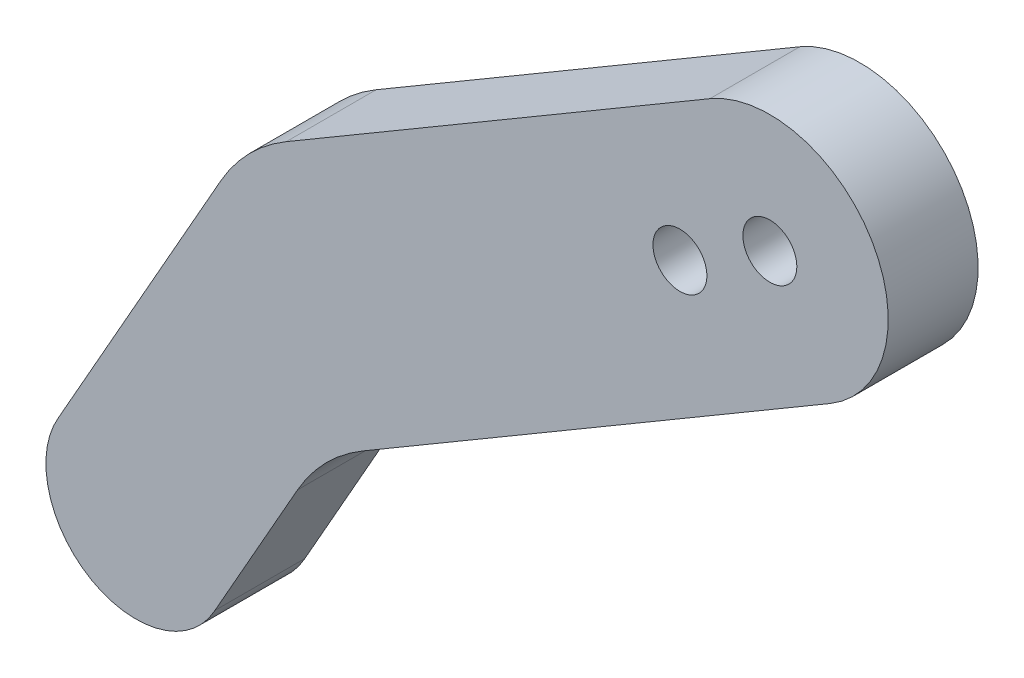
ISO-10303-21;
HEADER;
FILE_DESCRIPTION(('STEP AP214'),'2;1');
FILE_NAME('part.step','',(''),(''),'','','');
FILE_SCHEMA(('AUTOMOTIVE_DESIGN { 1 0 10303 214 1 1 1 1 }'));
ENDSEC;
DATA;
#1=APPLICATION_CONTEXT('core data for automotive mechanical design processes');
#2=APPLICATION_PROTOCOL_DEFINITION('international standard','automotive_design',2000,#1);
#3=PRODUCT_CONTEXT('',#1,'mechanical');
#4=PRODUCT('Part','Part','',(#3));
#5=PRODUCT_RELATED_PRODUCT_CATEGORY('part','',(#4));
#6=PRODUCT_DEFINITION_FORMATION('','',#4);
#7=PRODUCT_DEFINITION_CONTEXT('part definition',#1,'design');
#8=PRODUCT_DEFINITION('design','',#6,#7);
#9=PRODUCT_DEFINITION_SHAPE('','',#8);
#10=(LENGTH_UNIT() NAMED_UNIT(*) SI_UNIT(.MILLI.,.METRE.));
#11=(NAMED_UNIT(*) PLANE_ANGLE_UNIT() SI_UNIT($,.RADIAN.));
#12=(NAMED_UNIT(*) SI_UNIT($,.STERADIAN.) SOLID_ANGLE_UNIT());
#13=UNCERTAINTY_MEASURE_WITH_UNIT(LENGTH_MEASURE(1.E-05),#10,'distance_accuracy_value','');
#14=(GEOMETRIC_REPRESENTATION_CONTEXT(3) GLOBAL_UNCERTAINTY_ASSIGNED_CONTEXT((#13)) GLOBAL_UNIT_ASSIGNED_CONTEXT((#10,
#11,#12)) REPRESENTATION_CONTEXT('',''));
#15=CARTESIAN_POINT('',(0.,0.,0.));
#16=DIRECTION('',(0.,0.,1.));
#17=DIRECTION('',(1.,0.,0.));
#18=AXIS2_PLACEMENT_3D('',#15,#16,#17);
#19=CARTESIAN_POINT('',(8.69918007203384,-4.93196371380907,5.));
#20=DIRECTION('',(-0.869918007203384,0.493196371380907,0.));
#21=DIRECTION('',(-0.493196371380907,-0.869918007203384,0.));
#22=AXIS2_PLACEMENT_3D('',#19,#20,#21);
#23=PLANE('',#22);
#24=DIRECTION('',(0.493196371380907,0.869918007203384,0.));
#25=VECTOR('',#24,1.);
#26=CARTESIAN_POINT('',(8.69918007203384,-4.93196371380907,0.));
#27=LINE('',#26,#25);
#28=CARTESIAN_POINT('',(8.69918007203384,-4.93196371380907,0.));
#29=VERTEX_POINT('',#28);
#30=CARTESIAN_POINT('',(13.29602083439,3.17611409751714,0.));
#31=VERTEX_POINT('',#30);
#32=EDGE_CURVE('E132',#29,#31,#27,.T.);
#33=ORIENTED_EDGE('',*,*,#32,.T.);
#34=DIRECTION('',(0.,0.,-1.));
#35=VECTOR('',#34,1.);
#36=CARTESIAN_POINT('',(13.29602083439,3.17611409751714,5.));
#37=LINE('',#36,#35);
#38=CARTESIAN_POINT('',(13.29602083439,3.17611409751714,5.));
#39=VERTEX_POINT('',#38);
#40=EDGE_CURVE('E11',#39,#31,#37,.T.);
#41=ORIENTED_EDGE('',*,*,#40,.F.);
#42=DIRECTION('',(0.493196371380907,0.869918007203384,0.));
#43=VECTOR('',#42,1.);
#44=CARTESIAN_POINT('',(8.69918007203384,-4.93196371380907,5.));
#45=LINE('',#44,#43);
#46=CARTESIAN_POINT('',(8.69918007203384,-4.93196371380907,5.));
#47=VERTEX_POINT('',#46);
#48=EDGE_CURVE('E151',#47,#39,#45,.T.);
#49=ORIENTED_EDGE('',*,*,#48,.F.);
#50=DIRECTION('',(0.,0.,-1.));
#51=VECTOR('',#50,1.);
#52=CARTESIAN_POINT('',(8.69918007203384,-4.93196371380907,5.));
#53=LINE('',#52,#51);
#54=EDGE_CURVE('E128',#47,#29,#53,.T.);
#55=ORIENTED_EDGE('',*,*,#54,.T.);
#56=EDGE_LOOP('',(#33,#41,#49,#55));
#57=FACE_BOUND('',#56,.T.);
#58=ADVANCED_FACE('F35',(#57),#23,.F.);
#59=CARTESIAN_POINT('',(21.9952009064238,-1.75584961629193,5.));
#60=DIRECTION('',(0.,0.,-1.));
#61=DIRECTION('',(-1.,0.,0.));
#62=AXIS2_PLACEMENT_3D('',#59,#60,#61);
#63=CYLINDRICAL_SURFACE('',#62,10.);
#64=CARTESIAN_POINT('',(21.9952009064238,-1.75584961629193,0.));
#65=DIRECTION('',(0.,0.,1.));
#66=DIRECTION('',(1.,0.,0.));
#67=AXIS2_PLACEMENT_3D('',#64,#65,#66);
#68=CIRCLE('',#67,10.);
#69=CARTESIAN_POINT('',(16.9274718288517,6.86494628642669,0.));
#70=VERTEX_POINT('',#69);
#71=EDGE_CURVE('E135',#31,#70,#68,.F.);
#72=ORIENTED_EDGE('',*,*,#71,.T.);
#73=DIRECTION('',(0.,0.,-1.));
#74=VECTOR('',#73,1.);
#75=CARTESIAN_POINT('',(16.9274718288517,6.86494628642669,5.));
#76=LINE('',#75,#74);
#77=CARTESIAN_POINT('',(16.9274718288517,6.86494628642669,5.));
#78=VERTEX_POINT('',#77);
#79=EDGE_CURVE('E44',#78,#70,#76,.T.);
#80=ORIENTED_EDGE('',*,*,#79,.F.);
#81=CARTESIAN_POINT('',(21.9952009064238,-1.75584961629193,5.));
#82=DIRECTION('',(0.,0.,1.));
#83=DIRECTION('',(1.,0.,0.));
#84=AXIS2_PLACEMENT_3D('',#81,#82,#83);
#85=CIRCLE('',#84,10.);
#86=EDGE_CURVE('E92',#39,#78,#85,.F.);
#87=ORIENTED_EDGE('',*,*,#86,.F.);
#88=ORIENTED_EDGE('',*,*,#40,.T.);
#89=EDGE_LOOP('',(#72,#80,#87,#88));
#90=FACE_BOUND('',#89,.T.);
#91=ADVANCED_FACE('F201',(#90),#63,.F.);
#92=CARTESIAN_POINT('',(1.34814467413126,-2.29335071096395,5.));
#93=DIRECTION('',(-0.50677290775721,0.862079590271862,0.));
#94=DIRECTION('',(-0.862079590271862,-0.50677290775721,0.));
#95=AXIS2_PLACEMENT_3D('',#92,#93,#94);
#96=PLANE('',#95);
#97=DIRECTION('',(0.862079590271862,0.50677290775721,0.));
#98=VECTOR('',#97,1.);
#99=CARTESIAN_POINT('',(1.34814467413126,-2.29335071096395,0.));
#100=LINE('',#99,#98);
#101=CARTESIAN_POINT('',(42.8887717127369,22.1262789751689,0.));
#102=VERTEX_POINT('',#101);
#103=EDGE_CURVE('E138',#70,#102,#100,.T.);
#104=ORIENTED_EDGE('',*,*,#103,.T.);
#105=DIRECTION('',(0.,0.,-1.));
#106=VECTOR('',#105,1.);
#107=CARTESIAN_POINT('',(42.8887717127369,22.1262789751689,5.));
#108=LINE('',#107,#106);
#109=CARTESIAN_POINT('',(42.8887717127369,22.1262789751689,5.));
#110=VERTEX_POINT('',#109);
#111=EDGE_CURVE('E157',#110,#102,#108,.T.);
#112=ORIENTED_EDGE('',*,*,#111,.F.);
#113=DIRECTION('',(0.862079590271862,0.50677290775721,0.));
#114=VECTOR('',#113,1.);
#115=CARTESIAN_POINT('',(1.34814467413126,-2.29335071096395,5.));
#116=LINE('',#115,#114);
#117=EDGE_CURVE('E174',#78,#110,#116,.T.);
#118=ORIENTED_EDGE('',*,*,#117,.F.);
#119=ORIENTED_EDGE('',*,*,#79,.T.);
#120=EDGE_LOOP('',(#104,#112,#118,#119));
#121=FACE_BOUND('',#120,.T.);
#122=ADVANCED_FACE('F205',(#121),#96,.F.);
#123=CARTESIAN_POINT('',(39.5541416099459,27.7988721795781,5.));
#124=DIRECTION('',(0.,0.,-1.));
#125=DIRECTION('',(-1.,0.,0.));
#126=AXIS2_PLACEMENT_3D('',#123,#124,#125);
#127=CYLINDRICAL_SURFACE('',#126,6.58012701892219);
#128=CARTESIAN_POINT('',(39.5541416099459,27.7988721795781,0.));
#129=DIRECTION('',(0.,0.,1.));
#130=DIRECTION('',(1.,0.,0.));
#131=AXIS2_PLACEMENT_3D('',#128,#129,#130);
#132=CIRCLE('',#131,6.58012701892219);
#133=CARTESIAN_POINT('',(36.2195115071549,33.4714653839874,0.));
#134=VERTEX_POINT('',#133);
#135=EDGE_CURVE('E141',#134,#102,#132,.F.);
#136=ORIENTED_EDGE('',*,*,#135,.F.);
#137=DIRECTION('',(0.,0.,-1.));
#138=VECTOR('',#137,1.);
#139=CARTESIAN_POINT('',(36.2195115071549,33.4714653839874,5.));
#140=LINE('',#139,#138);
#141=CARTESIAN_POINT('',(36.2195115071549,33.4714653839874,5.));
#142=VERTEX_POINT('',#141);
#143=EDGE_CURVE('E155',#142,#134,#140,.T.);
#144=ORIENTED_EDGE('',*,*,#143,.F.);
#145=CARTESIAN_POINT('',(39.5541416099459,27.7988721795781,5.));
#146=DIRECTION('',(0.,0.,1.));
#147=DIRECTION('',(1.,0.,0.));
#148=AXIS2_PLACEMENT_3D('',#145,#146,#147);
#149=CIRCLE('',#148,6.58012701892219);
#150=EDGE_CURVE('E176',#142,#110,#149,.F.);
#151=ORIENTED_EDGE('',*,*,#150,.T.);
#152=ORIENTED_EDGE('',*,*,#111,.T.);
#153=EDGE_LOOP('',(#136,#144,#151,#152));
#154=FACE_BOUND('',#153,.T.);
#155=ADVANCED_FACE('F209',(#154),#127,.T.);
#156=CARTESIAN_POINT('',(-5.32111553145072,9.05183569785457,5.));
#157=DIRECTION('',(-0.50677290775721,0.862079590271863,0.));
#158=DIRECTION('',(-0.862079590271862,-0.50677290775721,0.));
#159=AXIS2_PLACEMENT_3D('',#156,#157,#158);
#160=PLANE('',#159);
#161=DIRECTION('',(0.862079590271863,0.50677290775721,0.));
#162=VECTOR('',#161,1.);
#163=CARTESIAN_POINT('',(-5.32111553145072,9.05183569785457,0.));
#164=LINE('',#163,#162);
#165=CARTESIAN_POINT('',(12.6670590992461,19.6261720650662,0.));
#166=VERTEX_POINT('',#165);
#167=EDGE_CURVE('E144',#166,#134,#164,.T.);
#168=ORIENTED_EDGE('',*,*,#167,.F.);
#169=DIRECTION('',(0.,0.,-1.));
#170=VECTOR('',#169,1.);
#171=CARTESIAN_POINT('',(12.6670590992461,19.6261720650662,5.));
#172=LINE('',#171,#170);
#173=CARTESIAN_POINT('',(12.6670590992461,19.6261720650662,5.));
#174=VERTEX_POINT('',#173);
#175=EDGE_CURVE('E117',#174,#166,#172,.T.);
#176=ORIENTED_EDGE('',*,*,#175,.F.);
#177=DIRECTION('',(0.862079590271863,0.50677290775721,0.));
#178=VECTOR('',#177,1.);
#179=CARTESIAN_POINT('',(-5.32111553145072,9.05183569785457,5.));
#180=LINE('',#179,#178);
#181=EDGE_CURVE('E124',#174,#142,#180,.T.);
#182=ORIENTED_EDGE('',*,*,#181,.T.);
#183=ORIENTED_EDGE('',*,*,#143,.T.);
#184=EDGE_LOOP('',(#168,#176,#182,#183));
#185=FACE_BOUND('',#184,.T.);
#186=ADVANCED_FACE('F180',(#185),#160,.T.);
#187=CARTESIAN_POINT('',(17.7347881768181,11.0053761623476,5.));
#188=DIRECTION('',(0.,0.,-1.));
#189=DIRECTION('',(-1.,0.,0.));
#190=AXIS2_PLACEMENT_3D('',#187,#188,#189);
#191=CYLINDRICAL_SURFACE('',#190,10.);
#192=CARTESIAN_POINT('',(17.7347881768181,11.0053761623476,0.));
#193=DIRECTION('',(0.,0.,1.));
#194=DIRECTION('',(1.,0.,0.));
#195=AXIS2_PLACEMENT_3D('',#192,#193,#194);
#196=CIRCLE('',#195,10.);
#197=CARTESIAN_POINT('',(9.03560810478431,15.9373398761567,0.));
#198=VERTEX_POINT('',#197);
#199=EDGE_CURVE('E112',#198,#166,#196,.F.);
#200=ORIENTED_EDGE('',*,*,#199,.F.);
#201=DIRECTION('',(0.,0.,-1.));
#202=VECTOR('',#201,1.);
#203=CARTESIAN_POINT('',(9.03560810478431,15.9373398761567,5.));
#204=LINE('',#203,#202);
#205=CARTESIAN_POINT('',(9.03560810478431,15.9373398761567,5.));
#206=VERTEX_POINT('',#205);
#207=EDGE_CURVE('E107',#206,#198,#204,.T.);
#208=ORIENTED_EDGE('',*,*,#207,.F.);
#209=CARTESIAN_POINT('',(17.7347881768181,11.0053761623476,5.));
#210=DIRECTION('',(0.,0.,1.));
#211=DIRECTION('',(1.,0.,0.));
#212=AXIS2_PLACEMENT_3D('',#209,#210,#211);
#213=CIRCLE('',#212,10.);
#214=EDGE_CURVE('E110',#206,#174,#213,.F.);
#215=ORIENTED_EDGE('',*,*,#214,.T.);
#216=ORIENTED_EDGE('',*,*,#175,.T.);
#217=EDGE_LOOP('',(#200,#208,#215,#216));
#218=FACE_BOUND('',#217,.T.);
#219=ADVANCED_FACE('F109',(#218),#191,.T.);
#220=CARTESIAN_POINT('',(0.,0.,5.));
#221=DIRECTION('',(-0.869918007203384,0.493196371380907,0.));
#222=DIRECTION('',(-0.493196371380907,-0.869918007203384,0.));
#223=AXIS2_PLACEMENT_3D('',#220,#221,#222);
#224=PLANE('',#223);
#225=DIRECTION('',(0.493196371380907,0.869918007203384,0.));
#226=VECTOR('',#225,1.);
#227=CARTESIAN_POINT('',(0.,0.,0.));
#228=LINE('',#227,#226);
#229=CARTESIAN_POINT('',(0.,0.,0.));
#230=VERTEX_POINT('',#229);
#231=EDGE_CURVE('E148',#230,#198,#228,.T.);
#232=ORIENTED_EDGE('',*,*,#231,.F.);
#233=DIRECTION('',(0.,0.,-1.));
#234=VECTOR('',#233,1.);
#235=CARTESIAN_POINT('',(0.,0.,5.));
#236=LINE('',#235,#234);
#237=CARTESIAN_POINT('',(0.,0.,5.));
#238=VERTEX_POINT('',#237);
#239=EDGE_CURVE('E81',#238,#230,#236,.T.);
#240=ORIENTED_EDGE('',*,*,#239,.F.);
#241=DIRECTION('',(0.493196371380907,0.869918007203384,0.));
#242=VECTOR('',#241,1.);
#243=CARTESIAN_POINT('',(0.,0.,5.));
#244=LINE('',#243,#242);
#245=EDGE_CURVE('E121',#238,#206,#244,.T.);
#246=ORIENTED_EDGE('',*,*,#245,.T.);
#247=ORIENTED_EDGE('',*,*,#207,.T.);
#248=EDGE_LOOP('',(#232,#240,#246,#247));
#249=FACE_BOUND('',#248,.T.);
#250=ADVANCED_FACE('F126',(#249),#224,.T.);
#251=CARTESIAN_POINT('',(4.30532765313558,-2.54405348545767,5.));
#252=DIRECTION('',(0.,0.,-1.));
#253=DIRECTION('',(-1.,0.,0.));
#254=AXIS2_PLACEMENT_3D('',#251,#252,#253);
#255=CYLINDRICAL_SURFACE('',#254,5.00080536891042);
#256=CARTESIAN_POINT('',(4.30532765313558,-2.54405348545767,0.));
#257=DIRECTION('',(0.,0.,1.));
#258=DIRECTION('',(1.,0.,0.));
#259=AXIS2_PLACEMENT_3D('',#256,#257,#258);
#260=CIRCLE('',#259,5.00080536891042);
#261=EDGE_CURVE('E84',#230,#29,#260,.T.);
#262=ORIENTED_EDGE('',*,*,#261,.T.);
#263=ORIENTED_EDGE('',*,*,#54,.F.);
#264=CARTESIAN_POINT('',(4.30532765313558,-2.54405348545767,5.));
#265=DIRECTION('',(0.,0.,1.));
#266=DIRECTION('',(1.,0.,0.));
#267=AXIS2_PLACEMENT_3D('',#264,#265,#266);
#268=CIRCLE('',#267,5.00080536891042);
#269=EDGE_CURVE('E53',#238,#47,#268,.T.);
#270=ORIENTED_EDGE('',*,*,#269,.F.);
#271=ORIENTED_EDGE('',*,*,#239,.T.);
#272=EDGE_LOOP('',(#262,#263,#270,#271));
#273=FACE_BOUND('',#272,.T.);
#274=ADVANCED_FACE('F189',(#273),#255,.T.);
#275=CARTESIAN_POINT('',(0.,0.,5.));
#276=DIRECTION('',(0.,0.,1.));
#277=DIRECTION('',(1.,0.,0.));
#278=AXIS2_PLACEMENT_3D('',#275,#276,#277);
#279=PLANE('',#278);
#280=CARTESIAN_POINT('',(34.5541416099459,24.8596255399645,5.));
#281=DIRECTION('',(0.,0.,1.));
#282=DIRECTION('',(1.,0.,0.));
#283=AXIS2_PLACEMENT_3D('',#280,#281,#282);
#284=CIRCLE('',#283,1.5);
#285=CARTESIAN_POINT('',(36.0541416099459,24.8596255399645,5.));
#286=VERTEX_POINT('',#285);
#287=EDGE_CURVE('E169',#286,#286,#284,.T.);
#288=ORIENTED_EDGE('',*,*,#287,.F.);
#289=EDGE_LOOP('',(#288));
#290=FACE_BOUND('',#289,.T.);
#291=CARTESIAN_POINT('',(39.5541416099459,27.7988721795781,5.));
#292=DIRECTION('',(0.,0.,1.));
#293=DIRECTION('',(1.,0.,0.));
#294=AXIS2_PLACEMENT_3D('',#291,#292,#293);
#295=CIRCLE('',#294,1.5);
#296=CARTESIAN_POINT('',(41.0541416099459,27.7988721795781,5.));
#297=VERTEX_POINT('',#296);
#298=EDGE_CURVE('E161',#297,#297,#295,.T.);
#299=ORIENTED_EDGE('',*,*,#298,.F.);
#300=EDGE_LOOP('',(#299));
#301=FACE_BOUND('',#300,.T.);
#302=ORIENTED_EDGE('',*,*,#48,.T.);
#303=ORIENTED_EDGE('',*,*,#86,.T.);
#304=ORIENTED_EDGE('',*,*,#117,.T.);
#305=ORIENTED_EDGE('',*,*,#150,.F.);
#306=ORIENTED_EDGE('',*,*,#181,.F.);
#307=ORIENTED_EDGE('',*,*,#214,.F.);
#308=ORIENTED_EDGE('',*,*,#245,.F.);
#309=ORIENTED_EDGE('',*,*,#269,.T.);
#310=EDGE_LOOP('',(#302,#303,#304,#305,#306,#307,#308,#309));
#311=FACE_BOUND('',#310,.T.);
#312=ADVANCED_FACE('F120',(#290,#301,#311),#279,.T.);
#313=CARTESIAN_POINT('',(0.,0.,0.));
#314=DIRECTION('',(0.,0.,1.));
#315=DIRECTION('',(1.,0.,0.));
#316=AXIS2_PLACEMENT_3D('',#313,#314,#315);
#317=PLANE('',#316);
#318=CARTESIAN_POINT('',(34.5541416099459,24.8596255399645,0.));
#319=DIRECTION('',(0.,0.,1.));
#320=DIRECTION('',(1.,0.,0.));
#321=AXIS2_PLACEMENT_3D('',#318,#319,#320);
#322=CIRCLE('',#321,1.5);
#323=CARTESIAN_POINT('',(36.0541416099459,24.8596255399645,0.));
#324=VERTEX_POINT('',#323);
#325=EDGE_CURVE('E38',#324,#324,#322,.T.);
#326=ORIENTED_EDGE('',*,*,#325,.T.);
#327=EDGE_LOOP('',(#326));
#328=FACE_BOUND('',#327,.T.);
#329=CARTESIAN_POINT('',(39.5541416099459,27.7988721795781,0.));
#330=DIRECTION('',(0.,0.,1.));
#331=DIRECTION('',(1.,0.,0.));
#332=AXIS2_PLACEMENT_3D('',#329,#330,#331);
#333=CIRCLE('',#332,1.5);
#334=CARTESIAN_POINT('',(41.0541416099459,27.7988721795781,0.));
#335=VERTEX_POINT('',#334);
#336=EDGE_CURVE('E136',#335,#335,#333,.T.);
#337=ORIENTED_EDGE('',*,*,#336,.T.);
#338=EDGE_LOOP('',(#337));
#339=FACE_BOUND('',#338,.T.);
#340=ORIENTED_EDGE('',*,*,#32,.F.);
#341=ORIENTED_EDGE('',*,*,#261,.F.);
#342=ORIENTED_EDGE('',*,*,#231,.T.);
#343=ORIENTED_EDGE('',*,*,#199,.T.);
#344=ORIENTED_EDGE('',*,*,#167,.T.);
#345=ORIENTED_EDGE('',*,*,#135,.T.);
#346=ORIENTED_EDGE('',*,*,#103,.F.);
#347=ORIENTED_EDGE('',*,*,#71,.F.);
#348=EDGE_LOOP('',(#340,#341,#342,#343,#344,#345,#346,#347));
#349=FACE_BOUND('',#348,.T.);
#350=ADVANCED_FACE('F184',(#328,#339,#349),#317,.F.);
#351=CARTESIAN_POINT('',(39.5541416099459,27.7988721795781,-2.));
#352=DIRECTION('',(0.,0.,1.));
#353=DIRECTION('',(1.,0.,0.));
#354=AXIS2_PLACEMENT_3D('',#351,#352,#353);
#355=CYLINDRICAL_SURFACE('',#354,1.5);
#356=ORIENTED_EDGE('',*,*,#298,.T.);
#357=EDGE_LOOP('',(#356));
#358=FACE_BOUND('',#357,.T.);
#359=ORIENTED_EDGE('',*,*,#336,.F.);
#360=EDGE_LOOP('',(#359));
#361=FACE_BOUND('',#360,.T.);
#362=ADVANCED_FACE('F246',(#358,#361),#355,.F.);
#363=CARTESIAN_POINT('',(34.5541416099459,24.8596255399645,-2.));
#364=DIRECTION('',(0.,0.,1.));
#365=DIRECTION('',(1.,0.,0.));
#366=AXIS2_PLACEMENT_3D('',#363,#364,#365);
#367=CYLINDRICAL_SURFACE('',#366,1.5);
#368=ORIENTED_EDGE('',*,*,#287,.T.);
#369=EDGE_LOOP('',(#368));
#370=FACE_BOUND('',#369,.T.);
#371=ORIENTED_EDGE('',*,*,#325,.F.);
#372=EDGE_LOOP('',(#371));
#373=FACE_BOUND('',#372,.T.);
#374=ADVANCED_FACE('F255',(#370,#373),#367,.F.);
#375=CLOSED_SHELL('',(#58,#91,#122,#155,#186,#219,#250,#274,#312,#350,#362,#374));
#376=MANIFOLD_SOLID_BREP('B2',#375);
#377=ADVANCED_BREP_SHAPE_REPRESENTATION('',(#18,#376),#14);
#378=SHAPE_DEFINITION_REPRESENTATION(#9,#377);
ENDSEC;
END-ISO-10303-21;
